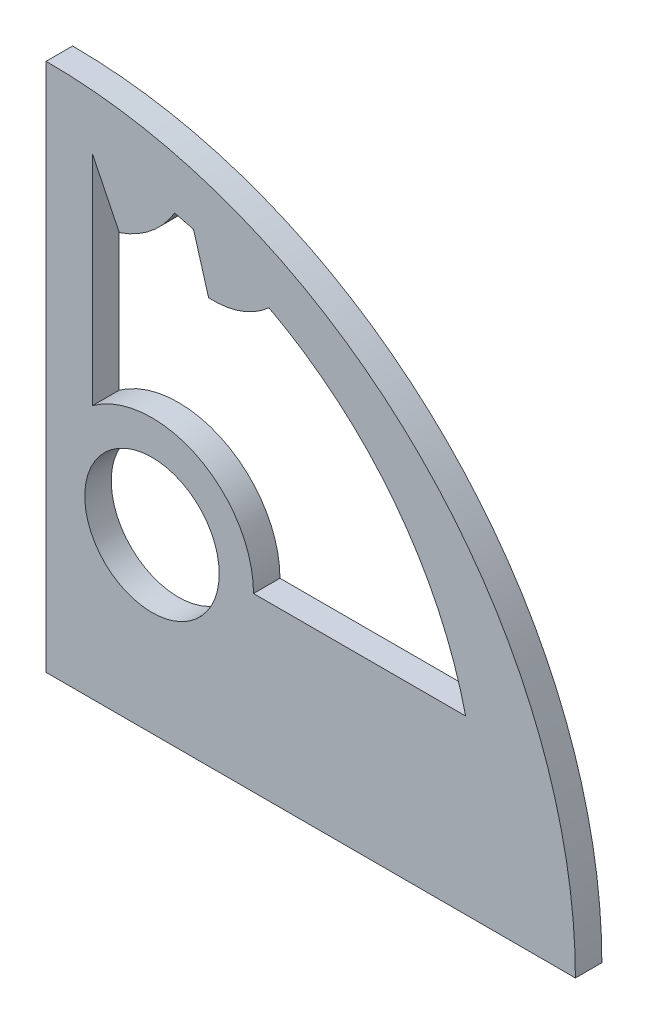
ISO-10303-21;
HEADER;
FILE_DESCRIPTION(('STEP AP214'),'2;1');
FILE_NAME('part.step','',(''),(''),'','','');
FILE_SCHEMA(('AUTOMOTIVE_DESIGN { 1 0 10303 214 1 1 1 1 }'));
ENDSEC;
DATA;
#1=APPLICATION_CONTEXT('core data for automotive mechanical design processes');
#2=APPLICATION_PROTOCOL_DEFINITION('international standard','automotive_design',2000,#1);
#3=PRODUCT_CONTEXT('',#1,'mechanical');
#4=PRODUCT('Part','Part','',(#3));
#5=PRODUCT_RELATED_PRODUCT_CATEGORY('part','',(#4));
#6=PRODUCT_DEFINITION_FORMATION('','',#4);
#7=PRODUCT_DEFINITION_CONTEXT('part definition',#1,'design');
#8=PRODUCT_DEFINITION('design','',#6,#7);
#9=PRODUCT_DEFINITION_SHAPE('','',#8);
#10=(LENGTH_UNIT() NAMED_UNIT(*) SI_UNIT(.MILLI.,.METRE.));
#11=(NAMED_UNIT(*) PLANE_ANGLE_UNIT() SI_UNIT($,.RADIAN.));
#12=(NAMED_UNIT(*) SI_UNIT($,.STERADIAN.) SOLID_ANGLE_UNIT());
#13=UNCERTAINTY_MEASURE_WITH_UNIT(LENGTH_MEASURE(1.E-05),#10,'distance_accuracy_value','');
#14=(GEOMETRIC_REPRESENTATION_CONTEXT(3) GLOBAL_UNCERTAINTY_ASSIGNED_CONTEXT((#13)) GLOBAL_UNIT_ASSIGNED_CONTEXT((#10,
#11,#12)) REPRESENTATION_CONTEXT('',''));
#15=CARTESIAN_POINT('',(0.,0.,0.));
#16=DIRECTION('',(0.,0.,1.));
#17=DIRECTION('',(1.,0.,0.));
#18=AXIS2_PLACEMENT_3D('',#15,#16,#17);
#19=CARTESIAN_POINT('',(0.,0.,5.));
#20=DIRECTION('',(0.,1.,0.));
#21=DIRECTION('',(0.,0.,1.));
#22=AXIS2_PLACEMENT_3D('',#19,#20,#21);
#23=PLANE('',#22);
#24=DIRECTION('',(1.,0.,0.));
#25=VECTOR('',#24,1.);
#26=CARTESIAN_POINT('',(0.,0.,0.));
#27=LINE('',#26,#25);
#28=CARTESIAN_POINT('',(0.,0.,0.));
#29=VERTEX_POINT('',#28);
#30=CARTESIAN_POINT('',(100.,0.,0.));
#31=VERTEX_POINT('',#30);
#32=EDGE_CURVE('E188',#29,#31,#27,.T.);
#33=ORIENTED_EDGE('',*,*,#32,.T.);
#34=DIRECTION('',(0.,0.,-1.));
#35=VECTOR('',#34,1.);
#36=CARTESIAN_POINT('',(100.,0.,5.));
#37=LINE('',#36,#35);
#38=CARTESIAN_POINT('',(100.,0.,5.));
#39=VERTEX_POINT('',#38);
#40=EDGE_CURVE('E199',#39,#31,#37,.T.);
#41=ORIENTED_EDGE('',*,*,#40,.F.);
#42=DIRECTION('',(1.,0.,0.));
#43=VECTOR('',#42,1.);
#44=CARTESIAN_POINT('',(0.,0.,5.));
#45=LINE('',#44,#43);
#46=CARTESIAN_POINT('',(0.,0.,5.));
#47=VERTEX_POINT('',#46);
#48=EDGE_CURVE('E179',#47,#39,#45,.T.);
#49=ORIENTED_EDGE('',*,*,#48,.F.);
#50=DIRECTION('',(0.,0.,-1.));
#51=VECTOR('',#50,1.);
#52=CARTESIAN_POINT('',(0.,0.,5.));
#53=LINE('',#52,#51);
#54=EDGE_CURVE('E187',#47,#29,#53,.T.);
#55=ORIENTED_EDGE('',*,*,#54,.T.);
#56=EDGE_LOOP('',(#33,#41,#49,#55));
#57=FACE_BOUND('',#56,.T.);
#58=ADVANCED_FACE('F33',(#57),#23,.F.);
#59=CARTESIAN_POINT('',(0.,0.,5.));
#60=DIRECTION('',(0.,0.,-1.));
#61=DIRECTION('',(-1.,0.,0.));
#62=AXIS2_PLACEMENT_3D('',#59,#60,#61);
#63=CYLINDRICAL_SURFACE('',#62,100.);
#64=CARTESIAN_POINT('',(0.,0.,0.));
#65=DIRECTION('',(0.,0.,1.));
#66=DIRECTION('',(1.,0.,0.));
#67=AXIS2_PLACEMENT_3D('',#64,#65,#66);
#68=CIRCLE('',#67,100.);
#69=CARTESIAN_POINT('',(0.,100.,0.));
#70=VERTEX_POINT('',#69);
#71=EDGE_CURVE('E191',#31,#70,#68,.T.);
#72=ORIENTED_EDGE('',*,*,#71,.T.);
#73=DIRECTION('',(0.,0.,-1.));
#74=VECTOR('',#73,1.);
#75=CARTESIAN_POINT('',(0.,100.,5.));
#76=LINE('',#75,#74);
#77=CARTESIAN_POINT('',(0.,100.,5.));
#78=VERTEX_POINT('',#77);
#79=EDGE_CURVE('E196',#78,#70,#76,.T.);
#80=ORIENTED_EDGE('',*,*,#79,.F.);
#81=CARTESIAN_POINT('',(0.,0.,5.));
#82=DIRECTION('',(0.,0.,1.));
#83=DIRECTION('',(1.,0.,0.));
#84=AXIS2_PLACEMENT_3D('',#81,#82,#83);
#85=CIRCLE('',#84,100.);
#86=EDGE_CURVE('E182',#39,#78,#85,.T.);
#87=ORIENTED_EDGE('',*,*,#86,.F.);
#88=ORIENTED_EDGE('',*,*,#40,.T.);
#89=EDGE_LOOP('',(#72,#80,#87,#88));
#90=FACE_BOUND('',#89,.T.);
#91=ADVANCED_FACE('F260',(#90),#63,.T.);
#92=CARTESIAN_POINT('',(0.,100.,5.));
#93=DIRECTION('',(1.,0.,0.));
#94=DIRECTION('',(0.,0.,-1.));
#95=AXIS2_PLACEMENT_3D('',#92,#93,#94);
#96=PLANE('',#95);
#97=DIRECTION('',(0.,-1.,0.));
#98=VECTOR('',#97,1.);
#99=CARTESIAN_POINT('',(0.,100.,0.));
#100=LINE('',#99,#98);
#101=EDGE_CURVE('E183',#70,#29,#100,.T.);
#102=ORIENTED_EDGE('',*,*,#101,.T.);
#103=ORIENTED_EDGE('',*,*,#54,.F.);
#104=DIRECTION('',(0.,-1.,0.));
#105=VECTOR('',#104,1.);
#106=CARTESIAN_POINT('',(0.,100.,5.));
#107=LINE('',#106,#105);
#108=EDGE_CURVE('E185',#78,#47,#107,.T.);
#109=ORIENTED_EDGE('',*,*,#108,.F.);
#110=ORIENTED_EDGE('',*,*,#79,.T.);
#111=EDGE_LOOP('',(#102,#103,#109,#110));
#112=FACE_BOUND('',#111,.T.);
#113=ADVANCED_FACE('F265',(#112),#96,.F.);
#114=CARTESIAN_POINT('',(0.,0.,5.));
#115=DIRECTION('',(0.,0.,1.));
#116=DIRECTION('',(1.,0.,0.));
#117=AXIS2_PLACEMENT_3D('',#114,#115,#116);
#118=PLANE('',#117);
#119=CARTESIAN_POINT('',(20.,32.5,5.));
#120=DIRECTION('',(0.,0.,-1.));
#121=DIRECTION('',(1.,0.,0.));
#122=AXIS2_PLACEMENT_3D('',#119,#120,#121);
#123=CIRCLE('',#122,19.1808597983038);
#124=CARTESIAN_POINT('',(8.78881248990143,48.063247001047,5.));
#125=VERTEX_POINT('',#124);
#126=CARTESIAN_POINT('',(39.1808597983038,32.5,5.));
#127=VERTEX_POINT('',#126);
#128=EDGE_CURVE('E47',#125,#127,#123,.T.);
#129=ORIENTED_EDGE('',*,*,#128,.F.);
#130=DIRECTION('',(0.,-1.,0.));
#131=VECTOR('',#130,1.);
#132=CARTESIAN_POINT('',(8.78881248990143,48.063247001047,5.));
#133=LINE('',#132,#131);
#134=CARTESIAN_POINT('',(8.78881248990143,89.152625790466,5.));
#135=VERTEX_POINT('',#134);
#136=EDGE_CURVE('E158',#135,#125,#133,.T.);
#137=ORIENTED_EDGE('',*,*,#136,.F.);
#138=DIRECTION('',(-0.440117802202296,0.897940042644619,0.));
#139=VECTOR('',#138,1.);
#140=CARTESIAN_POINT('',(8.78881248990143,89.152625790466,5.));
#141=LINE('',#140,#139);
#142=CARTESIAN_POINT('',(13.8261903367649,78.8752335650305,5.));
#143=VERTEX_POINT('',#142);
#144=EDGE_CURVE('E155',#143,#135,#141,.T.);
#145=ORIENTED_EDGE('',*,*,#144,.F.);
#146=CARTESIAN_POINT('',(7.60336720917256,97.2842659999168,5.));
#147=DIRECTION('',(0.,0.,-1.));
#148=DIRECTION('',(1.,0.,0.));
#149=AXIS2_PLACEMENT_3D('',#146,#147,#148);
#150=CIRCLE('',#149,19.4323442452524);
#151=CARTESIAN_POINT('',(24.2821691519057,87.3126277884154,5.));
#152=VERTEX_POINT('',#151);
#153=EDGE_CURVE('E152',#152,#143,#150,.T.);
#154=ORIENTED_EDGE('',*,*,#153,.F.);
#155=CARTESIAN_POINT('',(7.95204961782342,15.9573765997901,5.));
#156=DIRECTION('',(0.,0.,1.));
#157=DIRECTION('',(-1.,0.,0.));
#158=AXIS2_PLACEMENT_3D('',#155,#156,#157);
#159=CIRCLE('',#158,73.2000319411763);
#160=CARTESIAN_POINT('',(27.8560388534814,86.3993803241025,5.));
#161=VERTEX_POINT('',#160);
#162=EDGE_CURVE('E149',#161,#152,#159,.T.);
#163=ORIENTED_EDGE('',*,*,#162,.F.);
#164=DIRECTION('',(-0.279966204858308,0.96000985627088,0.));
#165=VECTOR('',#164,1.);
#166=CARTESIAN_POINT('',(27.8560388534814,86.3993803241025,5.));
#167=LINE('',#166,#165);
#168=CARTESIAN_POINT('',(30.6977220676004,76.6551903232617,5.));
#169=VERTEX_POINT('',#168);
#170=EDGE_CURVE('E143',#169,#161,#167,.T.);
#171=ORIENTED_EDGE('',*,*,#170,.F.);
#172=CARTESIAN_POINT('',(31.5869534671078,92.1678067270803,5.));
#173=DIRECTION('',(0.,0.,-1.));
#174=DIRECTION('',(1.,0.,0.));
#175=AXIS2_PLACEMENT_3D('',#172,#173,#174);
#176=CIRCLE('',#175,15.5380822553458);
#177=CARTESIAN_POINT('',(42.0847567716549,80.7123221911503,5.));
#178=VERTEX_POINT('',#177);
#179=EDGE_CURVE('E141',#178,#169,#176,.T.);
#180=ORIENTED_EDGE('',*,*,#179,.F.);
#181=CARTESIAN_POINT('',(7.95204961782342,15.9573765997901,5.));
#182=DIRECTION('',(0.,0.,1.));
#183=DIRECTION('',(-1.,0.,0.));
#184=AXIS2_PLACEMENT_3D('',#181,#182,#183);
#185=CIRCLE('',#184,73.2000319411763);
#186=CARTESIAN_POINT('',(79.258334664992,32.5,5.));
#187=VERTEX_POINT('',#186);
#188=EDGE_CURVE('E124',#187,#178,#185,.T.);
#189=ORIENTED_EDGE('',*,*,#188,.F.);
#190=DIRECTION('',(1.,0.,0.));
#191=VECTOR('',#190,1.);
#192=CARTESIAN_POINT('',(39.1808597983038,32.5,5.));
#193=LINE('',#192,#191);
#194=EDGE_CURVE('E133',#127,#187,#193,.T.);
#195=ORIENTED_EDGE('',*,*,#194,.F.);
#196=EDGE_LOOP('',(#129,#137,#145,#154,#163,#171,#180,#189,#195));
#197=FACE_BOUND('',#196,.T.);
#198=CARTESIAN_POINT('',(20.,32.5,5.));
#199=DIRECTION('',(0.,0.,1.));
#200=DIRECTION('',(1.,0.,0.));
#201=AXIS2_PLACEMENT_3D('',#198,#199,#200);
#202=CIRCLE('',#201,12.7);
#203=CARTESIAN_POINT('',(32.7,32.5,5.));
#204=VERTEX_POINT('',#203);
#205=EDGE_CURVE('E163',#204,#204,#202,.T.);
#206=ORIENTED_EDGE('',*,*,#205,.F.);
#207=EDGE_LOOP('',(#206));
#208=FACE_BOUND('',#207,.T.);
#209=ORIENTED_EDGE('',*,*,#48,.T.);
#210=ORIENTED_EDGE('',*,*,#86,.T.);
#211=ORIENTED_EDGE('',*,*,#108,.T.);
#212=EDGE_LOOP('',(#209,#210,#211));
#213=FACE_BOUND('',#212,.T.);
#214=ADVANCED_FACE('F137',(#197,#208,#213),#118,.T.);
#215=CARTESIAN_POINT('',(0.,0.,0.));
#216=DIRECTION('',(0.,0.,1.));
#217=DIRECTION('',(1.,0.,0.));
#218=AXIS2_PLACEMENT_3D('',#215,#216,#217);
#219=PLANE('',#218);
#220=DIRECTION('',(0.,-1.,0.));
#221=VECTOR('',#220,1.);
#222=CARTESIAN_POINT('',(8.78881248990143,0.,0.));
#223=LINE('',#222,#221);
#224=CARTESIAN_POINT('',(8.78881248990143,89.152625790466,0.));
#225=VERTEX_POINT('',#224);
#226=CARTESIAN_POINT('',(8.78881248990143,48.063247001047,0.));
#227=VERTEX_POINT('',#226);
#228=EDGE_CURVE('E40',#225,#227,#223,.T.);
#229=ORIENTED_EDGE('',*,*,#228,.T.);
#230=CARTESIAN_POINT('',(20.,32.5,0.));
#231=DIRECTION('',(0.,0.,1.));
#232=DIRECTION('',(1.,0.,0.));
#233=AXIS2_PLACEMENT_3D('',#230,#231,#232);
#234=CIRCLE('',#233,19.1808597983038);
#235=CARTESIAN_POINT('',(39.1808597983038,32.5,0.));
#236=VERTEX_POINT('',#235);
#237=EDGE_CURVE('E11',#227,#236,#234,.F.);
#238=ORIENTED_EDGE('',*,*,#237,.T.);
#239=DIRECTION('',(1.,0.,0.));
#240=VECTOR('',#239,1.);
#241=CARTESIAN_POINT('',(0.,32.5,0.));
#242=LINE('',#241,#240);
#243=CARTESIAN_POINT('',(79.258334664992,32.5,0.));
#244=VERTEX_POINT('',#243);
#245=EDGE_CURVE('E202',#236,#244,#242,.T.);
#246=ORIENTED_EDGE('',*,*,#245,.T.);
#247=CARTESIAN_POINT('',(7.95204961782342,15.9573765997901,0.));
#248=DIRECTION('',(0.,0.,1.));
#249=DIRECTION('',(1.,0.,0.));
#250=AXIS2_PLACEMENT_3D('',#247,#248,#249);
#251=CIRCLE('',#250,73.2000319411763);
#252=CARTESIAN_POINT('',(42.0847567716549,80.7123221911503,0.));
#253=VERTEX_POINT('',#252);
#254=EDGE_CURVE('E127',#244,#253,#251,.T.);
#255=ORIENTED_EDGE('',*,*,#254,.T.);
#256=CARTESIAN_POINT('',(31.5869534671078,92.1678067270803,0.));
#257=DIRECTION('',(0.,0.,1.));
#258=DIRECTION('',(1.,0.,0.));
#259=AXIS2_PLACEMENT_3D('',#256,#257,#258);
#260=CIRCLE('',#259,15.5380822553458);
#261=CARTESIAN_POINT('',(30.6977220676004,76.6551903232617,0.));
#262=VERTEX_POINT('',#261);
#263=EDGE_CURVE('E207',#253,#262,#260,.F.);
#264=ORIENTED_EDGE('',*,*,#263,.T.);
#265=DIRECTION('',(-0.279966204858308,0.96000985627088,0.));
#266=VECTOR('',#265,1.);
#267=CARTESIAN_POINT('',(48.8942413182771,14.2589527512537,0.));
#268=LINE('',#267,#266);
#269=CARTESIAN_POINT('',(27.8560388534814,86.3993803241025,0.));
#270=VERTEX_POINT('',#269);
#271=EDGE_CURVE('E210',#262,#270,#268,.T.);
#272=ORIENTED_EDGE('',*,*,#271,.T.);
#273=CARTESIAN_POINT('',(7.95204961782342,15.9573765997901,0.));
#274=DIRECTION('',(0.,0.,1.));
#275=DIRECTION('',(1.,0.,0.));
#276=AXIS2_PLACEMENT_3D('',#273,#274,#275);
#277=CIRCLE('',#276,73.2000319411763);
#278=CARTESIAN_POINT('',(24.2821691519057,87.3126277884154,0.));
#279=VERTEX_POINT('',#278);
#280=EDGE_CURVE('E213',#270,#279,#277,.T.);
#281=ORIENTED_EDGE('',*,*,#280,.T.);
#282=CARTESIAN_POINT('',(7.60336720917256,97.2842659999168,0.));
#283=DIRECTION('',(0.,0.,1.));
#284=DIRECTION('',(1.,0.,0.));
#285=AXIS2_PLACEMENT_3D('',#282,#283,#284);
#286=CIRCLE('',#285,19.4323442452524);
#287=CARTESIAN_POINT('',(13.8261903367649,78.8752335650305,0.));
#288=VERTEX_POINT('',#287);
#289=EDGE_CURVE('E216',#279,#288,#286,.F.);
#290=ORIENTED_EDGE('',*,*,#289,.T.);
#291=DIRECTION('',(-0.440117802202296,0.897940042644619,0.));
#292=VECTOR('',#291,1.);
#293=CARTESIAN_POINT('',(42.319451218882,20.7425250866478,0.));
#294=LINE('',#293,#292);
#295=EDGE_CURVE('E219',#288,#225,#294,.T.);
#296=ORIENTED_EDGE('',*,*,#295,.T.);
#297=EDGE_LOOP('',(#229,#238,#246,#255,#264,#272,#281,#290,#296));
#298=FACE_BOUND('',#297,.T.);
#299=CARTESIAN_POINT('',(20.,32.5,0.));
#300=DIRECTION('',(0.,0.,1.));
#301=DIRECTION('',(1.,0.,0.));
#302=AXIS2_PLACEMENT_3D('',#299,#300,#301);
#303=CIRCLE('',#302,12.7);
#304=CARTESIAN_POINT('',(32.7,32.5,0.));
#305=VERTEX_POINT('',#304);
#306=EDGE_CURVE('E178',#305,#305,#303,.T.);
#307=ORIENTED_EDGE('',*,*,#306,.T.);
#308=EDGE_LOOP('',(#307));
#309=FACE_BOUND('',#308,.T.);
#310=ORIENTED_EDGE('',*,*,#32,.F.);
#311=ORIENTED_EDGE('',*,*,#101,.F.);
#312=ORIENTED_EDGE('',*,*,#71,.F.);
#313=EDGE_LOOP('',(#310,#311,#312));
#314=FACE_BOUND('',#313,.T.);
#315=ADVANCED_FACE('F223',(#298,#309,#314),#219,.F.);
#316=CARTESIAN_POINT('',(20.,32.5,-5.));
#317=DIRECTION('',(0.,0.,1.));
#318=DIRECTION('',(1.,0.,0.));
#319=AXIS2_PLACEMENT_3D('',#316,#317,#318);
#320=CYLINDRICAL_SURFACE('',#319,12.7);
#321=ORIENTED_EDGE('',*,*,#205,.T.);
#322=EDGE_LOOP('',(#321));
#323=FACE_BOUND('',#322,.T.);
#324=ORIENTED_EDGE('',*,*,#306,.F.);
#325=EDGE_LOOP('',(#324));
#326=FACE_BOUND('',#325,.T.);
#327=ADVANCED_FACE('F249',(#323,#326),#320,.F.);
#328=CARTESIAN_POINT('',(20.,32.5,-5.));
#329=DIRECTION('',(0.,0.,1.));
#330=DIRECTION('',(1.,0.,0.));
#331=AXIS2_PLACEMENT_3D('',#328,#329,#330);
#332=CYLINDRICAL_SURFACE('',#331,19.1808597983038);
#333=DIRECTION('',(0.,0.,1.));
#334=VECTOR('',#333,1.);
#335=CARTESIAN_POINT('',(8.78881248990143,48.063247001047,-5.));
#336=LINE('',#335,#334);
#337=EDGE_CURVE('E161',#227,#125,#336,.T.);
#338=ORIENTED_EDGE('',*,*,#337,.T.);
#339=ORIENTED_EDGE('',*,*,#128,.T.);
#340=DIRECTION('',(0.,0.,1.));
#341=VECTOR('',#340,1.);
#342=CARTESIAN_POINT('',(39.1808597983038,32.5,-5.));
#343=LINE('',#342,#341);
#344=EDGE_CURVE('E130',#236,#127,#343,.T.);
#345=ORIENTED_EDGE('',*,*,#344,.F.);
#346=ORIENTED_EDGE('',*,*,#237,.F.);
#347=EDGE_LOOP('',(#338,#339,#345,#346));
#348=FACE_BOUND('',#347,.T.);
#349=ADVANCED_FACE('F247',(#348),#332,.T.);
#350=CARTESIAN_POINT('',(8.78881248990143,48.063247001047,-5.));
#351=DIRECTION('',(-1.,0.,0.));
#352=DIRECTION('',(0.,0.,1.));
#353=AXIS2_PLACEMENT_3D('',#350,#351,#352);
#354=PLANE('',#353);
#355=DIRECTION('',(0.,0.,1.));
#356=VECTOR('',#355,1.);
#357=CARTESIAN_POINT('',(8.78881248990143,89.152625790466,-5.));
#358=LINE('',#357,#356);
#359=EDGE_CURVE('E164',#225,#135,#358,.T.);
#360=ORIENTED_EDGE('',*,*,#359,.T.);
#361=ORIENTED_EDGE('',*,*,#136,.T.);
#362=ORIENTED_EDGE('',*,*,#337,.F.);
#363=ORIENTED_EDGE('',*,*,#228,.F.);
#364=EDGE_LOOP('',(#360,#361,#362,#363));
#365=FACE_BOUND('',#364,.T.);
#366=ADVANCED_FACE('F228',(#365),#354,.F.);
#367=CARTESIAN_POINT('',(8.78881248990143,89.152625790466,-5.));
#368=DIRECTION('',(0.897940042644619,0.440117802202296,0.));
#369=DIRECTION('',(-0.440117802202296,0.897940042644619,0.));
#370=AXIS2_PLACEMENT_3D('',#367,#368,#369);
#371=PLANE('',#370);
#372=DIRECTION('',(0.,0.,1.));
#373=VECTOR('',#372,1.);
#374=CARTESIAN_POINT('',(13.8261903367649,78.8752335650305,-5.));
#375=LINE('',#374,#373);
#376=EDGE_CURVE('E166',#288,#143,#375,.T.);
#377=ORIENTED_EDGE('',*,*,#376,.T.);
#378=ORIENTED_EDGE('',*,*,#144,.T.);
#379=ORIENTED_EDGE('',*,*,#359,.F.);
#380=ORIENTED_EDGE('',*,*,#295,.F.);
#381=EDGE_LOOP('',(#377,#378,#379,#380));
#382=FACE_BOUND('',#381,.T.);
#383=ADVANCED_FACE('F230',(#382),#371,.F.);
#384=CARTESIAN_POINT('',(7.60336720917256,97.2842659999168,-5.));
#385=DIRECTION('',(0.,0.,1.));
#386=DIRECTION('',(1.,0.,0.));
#387=AXIS2_PLACEMENT_3D('',#384,#385,#386);
#388=CYLINDRICAL_SURFACE('',#387,19.4323442452524);
#389=DIRECTION('',(0.,0.,1.));
#390=VECTOR('',#389,1.);
#391=CARTESIAN_POINT('',(24.2821691519057,87.3126277884154,-5.));
#392=LINE('',#391,#390);
#393=EDGE_CURVE('E168',#279,#152,#392,.T.);
#394=ORIENTED_EDGE('',*,*,#393,.T.);
#395=ORIENTED_EDGE('',*,*,#153,.T.);
#396=ORIENTED_EDGE('',*,*,#376,.F.);
#397=ORIENTED_EDGE('',*,*,#289,.F.);
#398=EDGE_LOOP('',(#394,#395,#396,#397));
#399=FACE_BOUND('',#398,.T.);
#400=ADVANCED_FACE('F237',(#399),#388,.T.);
#401=CARTESIAN_POINT('',(7.95204961782342,15.9573765997901,-5.));
#402=DIRECTION('',(0.,0.,1.));
#403=DIRECTION('',(1.,0.,0.));
#404=AXIS2_PLACEMENT_3D('',#401,#402,#403);
#405=CYLINDRICAL_SURFACE('',#404,73.2000319411763);
#406=DIRECTION('',(0.,0.,1.));
#407=VECTOR('',#406,1.);
#408=CARTESIAN_POINT('',(27.8560388534814,86.3993803241025,-5.));
#409=LINE('',#408,#407);
#410=EDGE_CURVE('E170',#270,#161,#409,.T.);
#411=ORIENTED_EDGE('',*,*,#410,.T.);
#412=ORIENTED_EDGE('',*,*,#162,.T.);
#413=ORIENTED_EDGE('',*,*,#393,.F.);
#414=ORIENTED_EDGE('',*,*,#280,.F.);
#415=EDGE_LOOP('',(#411,#412,#413,#414));
#416=FACE_BOUND('',#415,.T.);
#417=ADVANCED_FACE('F240',(#416),#405,.F.);
#418=CARTESIAN_POINT('',(27.8560388534814,86.3993803241025,-5.));
#419=DIRECTION('',(0.96000985627088,0.279966204858308,0.));
#420=DIRECTION('',(-0.279966204858308,0.96000985627088,0.));
#421=AXIS2_PLACEMENT_3D('',#418,#419,#420);
#422=PLANE('',#421);
#423=DIRECTION('',(0.,0.,1.));
#424=VECTOR('',#423,1.);
#425=CARTESIAN_POINT('',(30.6977220676004,76.6551903232617,-5.));
#426=LINE('',#425,#424);
#427=EDGE_CURVE('E172',#262,#169,#426,.T.);
#428=ORIENTED_EDGE('',*,*,#427,.T.);
#429=ORIENTED_EDGE('',*,*,#170,.T.);
#430=ORIENTED_EDGE('',*,*,#410,.F.);
#431=ORIENTED_EDGE('',*,*,#271,.F.);
#432=EDGE_LOOP('',(#428,#429,#430,#431));
#433=FACE_BOUND('',#432,.T.);
#434=ADVANCED_FACE('F243',(#433),#422,.F.);
#435=CARTESIAN_POINT('',(31.5869534671078,92.1678067270803,-5.));
#436=DIRECTION('',(0.,0.,1.));
#437=DIRECTION('',(1.,0.,0.));
#438=AXIS2_PLACEMENT_3D('',#435,#436,#437);
#439=CYLINDRICAL_SURFACE('',#438,15.5380822553458);
#440=DIRECTION('',(0.,0.,1.));
#441=VECTOR('',#440,1.);
#442=CARTESIAN_POINT('',(42.0847567716549,80.7123221911503,-5.));
#443=LINE('',#442,#441);
#444=EDGE_CURVE('E129',#253,#178,#443,.T.);
#445=ORIENTED_EDGE('',*,*,#444,.T.);
#446=ORIENTED_EDGE('',*,*,#179,.T.);
#447=ORIENTED_EDGE('',*,*,#427,.F.);
#448=ORIENTED_EDGE('',*,*,#263,.F.);
#449=EDGE_LOOP('',(#445,#446,#447,#448));
#450=FACE_BOUND('',#449,.T.);
#451=ADVANCED_FACE('F246',(#450),#439,.T.);
#452=CARTESIAN_POINT('',(7.95204961782342,15.9573765997901,-5.));
#453=DIRECTION('',(0.,0.,1.));
#454=DIRECTION('',(1.,0.,0.));
#455=AXIS2_PLACEMENT_3D('',#452,#453,#454);
#456=CYLINDRICAL_SURFACE('',#455,73.2000319411763);
#457=DIRECTION('',(0.,0.,1.));
#458=VECTOR('',#457,1.);
#459=CARTESIAN_POINT('',(79.258334664992,32.5,-5.));
#460=LINE('',#459,#458);
#461=EDGE_CURVE('E55',#244,#187,#460,.T.);
#462=ORIENTED_EDGE('',*,*,#461,.T.);
#463=ORIENTED_EDGE('',*,*,#188,.T.);
#464=ORIENTED_EDGE('',*,*,#444,.F.);
#465=ORIENTED_EDGE('',*,*,#254,.F.);
#466=EDGE_LOOP('',(#462,#463,#464,#465));
#467=FACE_BOUND('',#466,.T.);
#468=ADVANCED_FACE('F121',(#467),#456,.F.);
#469=CARTESIAN_POINT('',(39.1808597983038,32.5,-5.));
#470=DIRECTION('',(0.,-1.,0.));
#471=DIRECTION('',(0.,0.,-1.));
#472=AXIS2_PLACEMENT_3D('',#469,#470,#471);
#473=PLANE('',#472);
#474=ORIENTED_EDGE('',*,*,#344,.T.);
#475=ORIENTED_EDGE('',*,*,#194,.T.);
#476=ORIENTED_EDGE('',*,*,#461,.F.);
#477=ORIENTED_EDGE('',*,*,#245,.F.);
#478=EDGE_LOOP('',(#474,#475,#476,#477));
#479=FACE_BOUND('',#478,.T.);
#480=ADVANCED_FACE('F134',(#479),#473,.F.);
#481=CLOSED_SHELL('',(#58,#91,#113,#214,#315,#327,#349,#366,#383,#400,#417,#434,#451,#468,#480));
#482=MANIFOLD_SOLID_BREP('B2',#481);
#483=ADVANCED_BREP_SHAPE_REPRESENTATION('',(#18,#482),#14);
#484=SHAPE_DEFINITION_REPRESENTATION(#9,#483);
ENDSEC;
END-ISO-10303-21;
